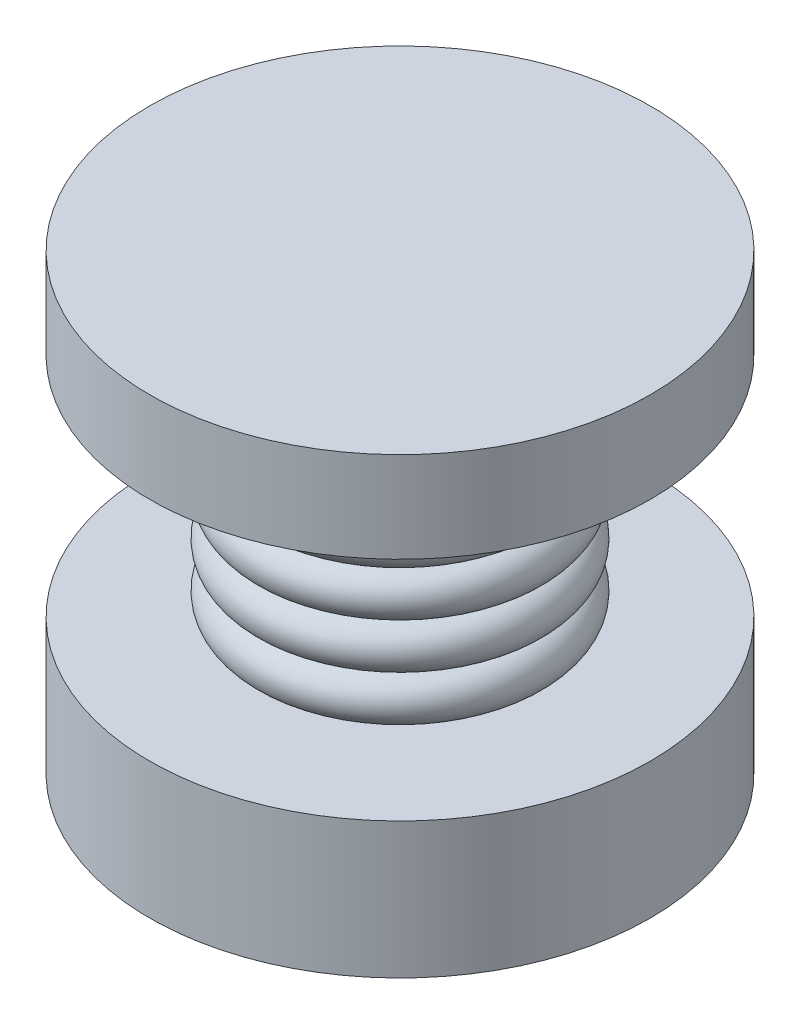
ISO-10303-21;
HEADER;
FILE_DESCRIPTION(('STEP AP214'),'2;1');
FILE_NAME('part.step','',(''),(''),'','','');
FILE_SCHEMA(('AUTOMOTIVE_DESIGN { 1 0 10303 214 1 1 1 1 }'));
ENDSEC;
DATA;
#1=APPLICATION_CONTEXT('core data for automotive mechanical design processes');
#2=APPLICATION_PROTOCOL_DEFINITION('international standard','automotive_design',2000,#1);
#3=PRODUCT_CONTEXT('',#1,'mechanical');
#4=PRODUCT('Part','Part','',(#3));
#5=PRODUCT_RELATED_PRODUCT_CATEGORY('part','',(#4));
#6=PRODUCT_DEFINITION_FORMATION('','',#4);
#7=PRODUCT_DEFINITION_CONTEXT('part definition',#1,'design');
#8=PRODUCT_DEFINITION('design','',#6,#7);
#9=PRODUCT_DEFINITION_SHAPE('','',#8);
#10=(LENGTH_UNIT() NAMED_UNIT(*) SI_UNIT(.MILLI.,.METRE.));
#11=(NAMED_UNIT(*) PLANE_ANGLE_UNIT() SI_UNIT($,.RADIAN.));
#12=(NAMED_UNIT(*) SI_UNIT($,.STERADIAN.) SOLID_ANGLE_UNIT());
#13=UNCERTAINTY_MEASURE_WITH_UNIT(LENGTH_MEASURE(1.E-05),#10,'distance_accuracy_value','');
#14=(GEOMETRIC_REPRESENTATION_CONTEXT(3) GLOBAL_UNCERTAINTY_ASSIGNED_CONTEXT((#13)) GLOBAL_UNIT_ASSIGNED_CONTEXT((#10,
#11,#12)) REPRESENTATION_CONTEXT('',''));
#15=CARTESIAN_POINT('',(0.,0.,0.));
#16=DIRECTION('',(0.,0.,1.));
#17=DIRECTION('',(1.,0.,0.));
#18=AXIS2_PLACEMENT_3D('',#15,#16,#17);
#19=CARTESIAN_POINT('',(0.,2.25,0.));
#20=DIRECTION('',(0.,1.,0.));
#21=DIRECTION('',(-1.,0.,0.));
#22=AXIS2_PLACEMENT_3D('',#19,#20,#21);
#23=TOROIDAL_SURFACE('',#22,1.38043077553799,0.25);
#24=CARTESIAN_POINT('',(0.,2.,0.));
#25=DIRECTION('',(0.,1.,0.));
#26=DIRECTION('',(-1.,0.,0.));
#27=AXIS2_PLACEMENT_3D('',#24,#25,#26);
#28=CIRCLE('',#27,1.38043077553801);
#29=CARTESIAN_POINT('',(-1.38043077553801,2.,0.));
#30=VERTEX_POINT('',#29);
#31=EDGE_CURVE('E52',#30,#30,#28,.T.);
#32=ORIENTED_EDGE('',*,*,#31,.T.);
#33=EDGE_LOOP('',(#32));
#34=FACE_BOUND('',#33,.T.);
#35=CARTESIAN_POINT('',(0.,2.5,0.));
#36=DIRECTION('',(0.,1.,0.));
#37=DIRECTION('',(-1.,0.,0.));
#38=AXIS2_PLACEMENT_3D('',#35,#36,#37);
#39=CIRCLE('',#38,1.38043077553801);
#40=CARTESIAN_POINT('',(-1.38043077553801,2.5,0.));
#41=VERTEX_POINT('',#40);
#42=EDGE_CURVE('E47',#41,#41,#39,.T.);
#43=ORIENTED_EDGE('',*,*,#42,.F.);
#44=EDGE_LOOP('',(#43));
#45=FACE_BOUND('',#44,.T.);
#46=ADVANCED_FACE('F32',(#34,#45),#23,.T.);
#47=CARTESIAN_POINT('',(0.,0.,0.));
#48=DIRECTION('',(0.,1.,0.));
#49=DIRECTION('',(-1.,0.,0.));
#50=AXIS2_PLACEMENT_3D('',#47,#48,#49);
#51=PLANE('',#50);
#52=CARTESIAN_POINT('',(0.,0.,0.));
#53=DIRECTION('',(0.,1.,0.));
#54=DIRECTION('',(-1.,0.,0.));
#55=AXIS2_PLACEMENT_3D('',#52,#53,#54);
#56=CIRCLE('',#55,2.76086155107602);
#57=CARTESIAN_POINT('',(-2.76086155107602,0.,0.));
#58=VERTEX_POINT('',#57);
#59=EDGE_CURVE('E61',#58,#58,#56,.T.);
#60=ORIENTED_EDGE('',*,*,#59,.F.);
#61=EDGE_LOOP('',(#60));
#62=FACE_BOUND('',#61,.T.);
#63=ADVANCED_FACE('F85',(#62),#51,.F.);
#64=CARTESIAN_POINT('',(0.,5.,0.));
#65=DIRECTION('',(0.,1.,0.));
#66=DIRECTION('',(-1.,0.,0.));
#67=AXIS2_PLACEMENT_3D('',#64,#65,#66);
#68=CYLINDRICAL_SURFACE('',#67,2.76086155107602);
#69=CARTESIAN_POINT('',(0.,1.5,0.));
#70=DIRECTION('',(0.,1.,0.));
#71=DIRECTION('',(-1.,0.,0.));
#72=AXIS2_PLACEMENT_3D('',#69,#70,#71);
#73=CIRCLE('',#72,2.76086155107602);
#74=CARTESIAN_POINT('',(-2.76086155107602,1.5,0.));
#75=VERTEX_POINT('',#74);
#76=EDGE_CURVE('E58',#75,#75,#73,.T.);
#77=ORIENTED_EDGE('',*,*,#76,.F.);
#78=EDGE_LOOP('',(#77));
#79=FACE_BOUND('',#78,.T.);
#80=ORIENTED_EDGE('',*,*,#59,.T.);
#81=EDGE_LOOP('',(#80));
#82=FACE_BOUND('',#81,.T.);
#83=ADVANCED_FACE('F91',(#79,#82),#68,.T.);
#84=CARTESIAN_POINT('',(0.,1.5,0.));
#85=DIRECTION('',(0.,-1.,0.));
#86=DIRECTION('',(1.,0.,0.));
#87=AXIS2_PLACEMENT_3D('',#84,#85,#86);
#88=PLANE('',#87);
#89=CARTESIAN_POINT('',(0.,1.5,0.));
#90=DIRECTION('',(0.,1.,0.));
#91=DIRECTION('',(-1.,0.,0.));
#92=AXIS2_PLACEMENT_3D('',#89,#90,#91);
#93=CIRCLE('',#92,1.38043077553801);
#94=CARTESIAN_POINT('',(-1.38043077553801,1.5,0.));
#95=VERTEX_POINT('',#94);
#96=EDGE_CURVE('E55',#95,#95,#93,.T.);
#97=ORIENTED_EDGE('',*,*,#96,.F.);
#98=EDGE_LOOP('',(#97));
#99=FACE_BOUND('',#98,.T.);
#100=ORIENTED_EDGE('',*,*,#76,.T.);
#101=EDGE_LOOP('',(#100));
#102=FACE_BOUND('',#101,.T.);
#103=ADVANCED_FACE('F81',(#99,#102),#88,.F.);
#104=CARTESIAN_POINT('',(0.,1.75,0.));
#105=DIRECTION('',(0.,1.,0.));
#106=DIRECTION('',(-1.,0.,0.));
#107=AXIS2_PLACEMENT_3D('',#104,#105,#106);
#108=TOROIDAL_SURFACE('',#107,1.38043077553799,0.25);
#109=ORIENTED_EDGE('',*,*,#96,.T.);
#110=EDGE_LOOP('',(#109));
#111=FACE_BOUND('',#110,.T.);
#112=ORIENTED_EDGE('',*,*,#31,.F.);
#113=EDGE_LOOP('',(#112));
#114=FACE_BOUND('',#113,.T.);
#115=ADVANCED_FACE('F75',(#111,#114),#108,.T.);
#116=CARTESIAN_POINT('',(0.,4.,0.));
#117=DIRECTION('',(0.,1.,0.));
#118=DIRECTION('',(-1.,0.,0.));
#119=AXIS2_PLACEMENT_3D('',#116,#117,#118);
#120=PLANE('',#119);
#121=CARTESIAN_POINT('',(0.,4.,0.));
#122=DIRECTION('',(0.,1.,0.));
#123=DIRECTION('',(-1.,0.,0.));
#124=AXIS2_PLACEMENT_3D('',#121,#122,#123);
#125=CIRCLE('',#124,2.76086155107602);
#126=CARTESIAN_POINT('',(-2.76086155107602,4.,0.));
#127=VERTEX_POINT('',#126);
#128=EDGE_CURVE('E67',#127,#127,#125,.T.);
#129=ORIENTED_EDGE('',*,*,#128,.F.);
#130=EDGE_LOOP('',(#129));
#131=FACE_BOUND('',#130,.T.);
#132=CARTESIAN_POINT('',(0.,4.,0.));
#133=DIRECTION('',(0.,1.,0.));
#134=DIRECTION('',(-1.,0.,0.));
#135=AXIS2_PLACEMENT_3D('',#132,#133,#134);
#136=CIRCLE('',#135,1.38043077553801);
#137=CARTESIAN_POINT('',(-1.38043077553801,4.,0.));
#138=VERTEX_POINT('',#137);
#139=EDGE_CURVE('E10',#138,#138,#136,.T.);
#140=ORIENTED_EDGE('',*,*,#139,.T.);
#141=EDGE_LOOP('',(#140));
#142=FACE_BOUND('',#141,.T.);
#143=ADVANCED_FACE('F34',(#131,#142),#120,.F.);
#144=CARTESIAN_POINT('',(0.,3.75,0.));
#145=DIRECTION('',(0.,1.,0.));
#146=DIRECTION('',(-1.,0.,0.));
#147=AXIS2_PLACEMENT_3D('',#144,#145,#146);
#148=TOROIDAL_SURFACE('',#147,1.38043077553801,0.25);
#149=CARTESIAN_POINT('',(0.,3.5,0.));
#150=DIRECTION('',(0.,1.,0.));
#151=DIRECTION('',(-1.,0.,0.));
#152=AXIS2_PLACEMENT_3D('',#149,#150,#151);
#153=CIRCLE('',#152,1.38043077553801);
#154=CARTESIAN_POINT('',(-1.38043077553801,3.5,0.));
#155=VERTEX_POINT('',#154);
#156=EDGE_CURVE('E39',#155,#155,#153,.T.);
#157=ORIENTED_EDGE('',*,*,#156,.T.);
#158=EDGE_LOOP('',(#157));
#159=FACE_BOUND('',#158,.T.);
#160=ORIENTED_EDGE('',*,*,#139,.F.);
#161=EDGE_LOOP('',(#160));
#162=FACE_BOUND('',#161,.T.);
#163=ADVANCED_FACE('F74',(#159,#162),#148,.T.);
#164=CARTESIAN_POINT('',(0.,3.25,0.));
#165=DIRECTION('',(0.,1.,0.));
#166=DIRECTION('',(-1.,0.,0.));
#167=AXIS2_PLACEMENT_3D('',#164,#165,#166);
#168=TOROIDAL_SURFACE('',#167,1.380430775538,0.25);
#169=CARTESIAN_POINT('',(0.,3.,0.));
#170=DIRECTION('',(0.,1.,0.));
#171=DIRECTION('',(-1.,0.,0.));
#172=AXIS2_PLACEMENT_3D('',#169,#170,#171);
#173=CIRCLE('',#172,1.38043077553801);
#174=CARTESIAN_POINT('',(-1.38043077553801,3.,0.));
#175=VERTEX_POINT('',#174);
#176=EDGE_CURVE('E43',#175,#175,#173,.T.);
#177=ORIENTED_EDGE('',*,*,#176,.T.);
#178=EDGE_LOOP('',(#177));
#179=FACE_BOUND('',#178,.T.);
#180=ORIENTED_EDGE('',*,*,#156,.F.);
#181=EDGE_LOOP('',(#180));
#182=FACE_BOUND('',#181,.T.);
#183=ADVANCED_FACE('F80',(#179,#182),#168,.T.);
#184=CARTESIAN_POINT('',(0.,2.75,0.));
#185=DIRECTION('',(0.,1.,0.));
#186=DIRECTION('',(-1.,0.,0.));
#187=AXIS2_PLACEMENT_3D('',#184,#185,#186);
#188=TOROIDAL_SURFACE('',#187,1.380430775538,0.25);
#189=ORIENTED_EDGE('',*,*,#42,.T.);
#190=EDGE_LOOP('',(#189));
#191=FACE_BOUND('',#190,.T.);
#192=ORIENTED_EDGE('',*,*,#176,.F.);
#193=EDGE_LOOP('',(#192));
#194=FACE_BOUND('',#193,.T.);
#195=ADVANCED_FACE('F97',(#191,#194),#188,.T.);
#196=CARTESIAN_POINT('',(0.,5.,0.));
#197=DIRECTION('',(0.,-1.,0.));
#198=DIRECTION('',(1.,0.,0.));
#199=AXIS2_PLACEMENT_3D('',#196,#197,#198);
#200=PLANE('',#199);
#201=CARTESIAN_POINT('',(0.,5.,0.));
#202=DIRECTION('',(0.,1.,0.));
#203=DIRECTION('',(-1.,0.,0.));
#204=AXIS2_PLACEMENT_3D('',#201,#202,#203);
#205=CIRCLE('',#204,2.76086155107602);
#206=CARTESIAN_POINT('',(-2.76086155107602,5.,0.));
#207=VERTEX_POINT('',#206);
#208=EDGE_CURVE('E64',#207,#207,#205,.T.);
#209=ORIENTED_EDGE('',*,*,#208,.T.);
#210=EDGE_LOOP('',(#209));
#211=FACE_BOUND('',#210,.T.);
#212=ADVANCED_FACE('F100',(#211),#200,.F.);
#213=CARTESIAN_POINT('',(0.,5.,0.));
#214=DIRECTION('',(0.,1.,0.));
#215=DIRECTION('',(-1.,0.,0.));
#216=AXIS2_PLACEMENT_3D('',#213,#214,#215);
#217=CYLINDRICAL_SURFACE('',#216,2.76086155107602);
#218=ORIENTED_EDGE('',*,*,#208,.F.);
#219=EDGE_LOOP('',(#218));
#220=FACE_BOUND('',#219,.T.);
#221=ORIENTED_EDGE('',*,*,#128,.T.);
#222=EDGE_LOOP('',(#221));
#223=FACE_BOUND('',#222,.T.);
#224=ADVANCED_FACE('F71',(#220,#223),#217,.T.);
#225=CLOSED_SHELL('',(#46,#63,#83,#103,#115,#143,#163,#183,#195,#212,#224));
#226=MANIFOLD_SOLID_BREP('B2',#225);
#227=ADVANCED_BREP_SHAPE_REPRESENTATION('',(#18,#226),#14);
#228=SHAPE_DEFINITION_REPRESENTATION(#9,#227);
ENDSEC;
END-ISO-10303-21;
